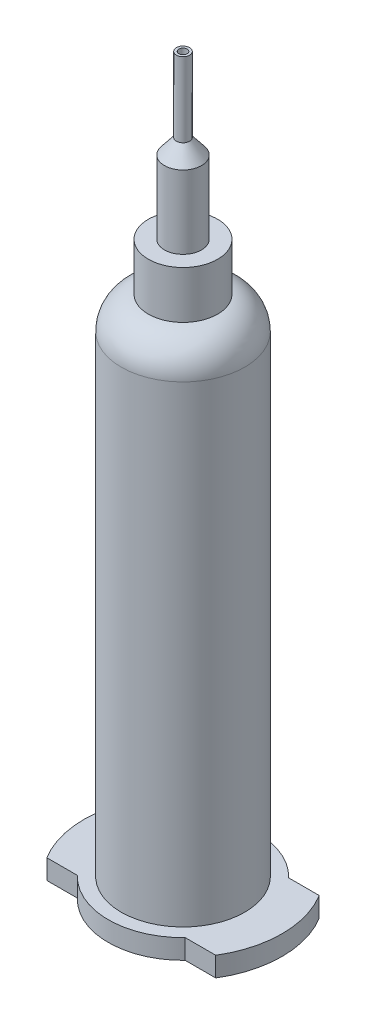
ISO-10303-21;
HEADER;
FILE_DESCRIPTION(('STEP AP214'),'2;1');
FILE_NAME('part.step','',(''),(''),'','','');
FILE_SCHEMA(('AUTOMOTIVE_DESIGN { 1 0 10303 214 1 1 1 1 }'));
ENDSEC;
DATA;
#1=APPLICATION_CONTEXT('core data for automotive mechanical design processes');
#2=APPLICATION_PROTOCOL_DEFINITION('international standard','automotive_design',2000,#1);
#3=PRODUCT_CONTEXT('',#1,'mechanical');
#4=PRODUCT('Part','Part','',(#3));
#5=PRODUCT_RELATED_PRODUCT_CATEGORY('part','',(#4));
#6=PRODUCT_DEFINITION_FORMATION('','',#4);
#7=PRODUCT_DEFINITION_CONTEXT('part definition',#1,'design');
#8=PRODUCT_DEFINITION('design','',#6,#7);
#9=PRODUCT_DEFINITION_SHAPE('','',#8);
#10=(LENGTH_UNIT() NAMED_UNIT(*) SI_UNIT(.MILLI.,.METRE.));
#11=(NAMED_UNIT(*) PLANE_ANGLE_UNIT() SI_UNIT($,.RADIAN.));
#12=(NAMED_UNIT(*) SI_UNIT($,.STERADIAN.) SOLID_ANGLE_UNIT());
#13=UNCERTAINTY_MEASURE_WITH_UNIT(LENGTH_MEASURE(1.E-05),#10,'distance_accuracy_value','');
#14=(GEOMETRIC_REPRESENTATION_CONTEXT(3) GLOBAL_UNCERTAINTY_ASSIGNED_CONTEXT((#13)) GLOBAL_UNIT_ASSIGNED_CONTEXT((#10,
#11,#12)) REPRESENTATION_CONTEXT('',''));
#15=CARTESIAN_POINT('',(0.,0.,0.));
#16=DIRECTION('',(0.,0.,1.));
#17=DIRECTION('',(1.,0.,0.));
#18=AXIS2_PLACEMENT_3D('',#15,#16,#17);
#19=CARTESIAN_POINT('',(0.,-14.38,0.));
#20=DIRECTION('',(0.,1.,0.));
#21=DIRECTION('',(0.,0.,1.));
#22=AXIS2_PLACEMENT_3D('',#19,#20,#21);
#23=CYLINDRICAL_SURFACE('',#22,7.925);
#24=CARTESIAN_POINT('',(0.,-14.38,0.));
#25=DIRECTION('',(0.,1.,0.));
#26=DIRECTION('',(0.,0.,1.));
#27=AXIS2_PLACEMENT_3D('',#24,#25,#26);
#28=CIRCLE('',#27,7.925);
#29=CARTESIAN_POINT('',(0.,-14.38,7.925));
#30=VERTEX_POINT('',#29);
#31=EDGE_CURVE('E11',#30,#30,#28,.T.);
#32=ORIENTED_EDGE('',*,*,#31,.T.);
#33=EDGE_LOOP('',(#32));
#34=FACE_BOUND('',#33,.T.);
#35=CARTESIAN_POINT('',(0.,16.62,0.));
#36=DIRECTION('',(0.,1.,0.));
#37=DIRECTION('',(0.,0.,1.));
#38=AXIS2_PLACEMENT_3D('',#35,#36,#37);
#39=CIRCLE('',#38,7.925);
#40=CARTESIAN_POINT('',(0.,16.62,7.925));
#41=VERTEX_POINT('',#40);
#42=EDGE_CURVE('E52',#41,#41,#39,.T.);
#43=ORIENTED_EDGE('',*,*,#42,.F.);
#44=EDGE_LOOP('',(#43));
#45=FACE_BOUND('',#44,.T.);
#46=ADVANCED_FACE('F49',(#34,#45),#23,.T.);
#47=CARTESIAN_POINT('',(0.,-14.38,0.));
#48=DIRECTION('',(0.,1.,0.));
#49=DIRECTION('',(0.,0.,1.));
#50=AXIS2_PLACEMENT_3D('',#47,#48,#49);
#51=PLANE('',#50);
#52=ORIENTED_EDGE('',*,*,#31,.F.);
#53=EDGE_LOOP('',(#52));
#54=FACE_BOUND('',#53,.T.);
#55=ADVANCED_FACE('F64',(#54),#51,.F.);
#56=CARTESIAN_POINT('',(0.,16.62,0.));
#57=DIRECTION('',(0.,1.,0.));
#58=DIRECTION('',(0.,0.,1.));
#59=AXIS2_PLACEMENT_3D('',#56,#57,#58);
#60=PLANE('',#59);
#61=ORIENTED_EDGE('',*,*,#42,.T.);
#62=EDGE_LOOP('',(#61));
#63=FACE_BOUND('',#62,.T.);
#64=ADVANCED_FACE('F61',(#63),#60,.T.);
#65=CLOSED_SHELL('',(#46,#55,#64));
#66=MANIFOLD_SOLID_BREP('B2',#65);
#67=CARTESIAN_POINT('',(0.,24.5223538498266,0.));
#68=DIRECTION('',(0.,1.,0.));
#69=DIRECTION('',(0.,0.,1.));
#70=AXIS2_PLACEMENT_3D('',#67,#68,#69);
#71=CYLINDRICAL_SURFACE('',#70,15.075);
#72=DIRECTION('',(0.,1.,0.));
#73=VECTOR('',#72,1.);
#74=CARTESIAN_POINT('',(-12.8545711713771,-84.0783145535444,-7.875));
#75=LINE('',#74,#73);
#76=CARTESIAN_POINT('',(-12.8545711713771,-57.38,-7.875));
#77=VERTEX_POINT('',#76);
#78=CARTESIAN_POINT('',(-12.8545711713771,-54.38,-7.875));
#79=VERTEX_POINT('',#78);
#80=EDGE_CURVE('E194',#77,#79,#75,.T.);
#81=ORIENTED_EDGE('',*,*,#80,.F.);
#82=CARTESIAN_POINT('',(0.,-57.38,0.));
#83=DIRECTION('',(0.,1.,0.));
#84=DIRECTION('',(0.,0.,1.));
#85=AXIS2_PLACEMENT_3D('',#82,#83,#84);
#86=CIRCLE('',#85,15.075);
#87=CARTESIAN_POINT('',(-12.8545711713771,-57.38,7.875));
#88=VERTEX_POINT('',#87);
#89=EDGE_CURVE('E182',#77,#88,#86,.T.);
#90=ORIENTED_EDGE('',*,*,#89,.T.);
#91=DIRECTION('',(0.,1.,0.));
#92=VECTOR('',#91,1.);
#93=CARTESIAN_POINT('',(-12.8545711713771,-84.0783145535444,7.875));
#94=LINE('',#93,#92);
#95=CARTESIAN_POINT('',(-12.8545711713771,-54.38,7.875));
#96=VERTEX_POINT('',#95);
#97=EDGE_CURVE('E200',#88,#96,#94,.T.);
#98=ORIENTED_EDGE('',*,*,#97,.T.);
#99=CARTESIAN_POINT('',(0.,-54.38,0.));
#100=DIRECTION('',(0.,1.,0.));
#101=DIRECTION('',(0.,0.,1.));
#102=AXIS2_PLACEMENT_3D('',#99,#100,#101);
#103=CIRCLE('',#102,15.075);
#104=EDGE_CURVE('E197',#79,#96,#103,.T.);
#105=ORIENTED_EDGE('',*,*,#104,.F.);
#106=EDGE_LOOP('',(#81,#90,#98,#105));
#107=FACE_BOUND('',#106,.T.);
#108=ADVANCED_FACE('F96',(#107),#71,.T.);
#109=CARTESIAN_POINT('',(0.,24.5223538498266,0.));
#110=DIRECTION('',(0.,1.,0.));
#111=DIRECTION('',(0.,0.,1.));
#112=AXIS2_PLACEMENT_3D('',#109,#110,#111);
#113=CYLINDRICAL_SURFACE('',#112,1.);
#114=CARTESIAN_POINT('',(0.,43.03,0.));
#115=DIRECTION('',(0.,1.,0.));
#116=DIRECTION('',(0.,0.,1.));
#117=AXIS2_PLACEMENT_3D('',#114,#115,#116);
#118=CIRCLE('',#117,1.);
#119=CARTESIAN_POINT('',(0.,43.03,1.));
#120=VERTEX_POINT('',#119);
#121=EDGE_CURVE('E225',#120,#120,#118,.T.);
#122=ORIENTED_EDGE('',*,*,#121,.T.);
#123=EDGE_LOOP('',(#122));
#124=FACE_BOUND('',#123,.T.);
#125=CARTESIAN_POINT('',(0.,54.38,0.));
#126=DIRECTION('',(0.,1.,0.));
#127=DIRECTION('',(0.,0.,1.));
#128=AXIS2_PLACEMENT_3D('',#125,#126,#127);
#129=CIRCLE('',#128,1.);
#130=CARTESIAN_POINT('',(0.,54.38,1.));
#131=VERTEX_POINT('',#130);
#132=EDGE_CURVE('E222',#131,#131,#129,.T.);
#133=ORIENTED_EDGE('',*,*,#132,.F.);
#134=EDGE_LOOP('',(#133));
#135=FACE_BOUND('',#134,.T.);
#136=ADVANCED_FACE('F285',(#124,#135),#113,.T.);
#137=CARTESIAN_POINT('',(0.,54.38,0.));
#138=DIRECTION('',(0.,1.,0.));
#139=DIRECTION('',(0.,0.,1.));
#140=AXIS2_PLACEMENT_3D('',#137,#138,#139);
#141=PLANE('',#140);
#142=CARTESIAN_POINT('',(0.,54.38,0.));
#143=DIRECTION('',(0.,1.,0.));
#144=DIRECTION('',(0.,0.,1.));
#145=AXIS2_PLACEMENT_3D('',#142,#143,#144);
#146=CIRCLE('',#145,0.627370955077484);
#147=CARTESIAN_POINT('',(0.,54.38,0.627370955077484));
#148=VERTEX_POINT('',#147);
#149=EDGE_CURVE('E356',#148,#148,#146,.T.);
#150=ORIENTED_EDGE('',*,*,#149,.F.);
#151=EDGE_LOOP('',(#150));
#152=FACE_BOUND('',#151,.T.);
#153=ORIENTED_EDGE('',*,*,#132,.T.);
#154=EDGE_LOOP('',(#153));
#155=FACE_BOUND('',#154,.T.);
#156=ADVANCED_FACE('F283',(#152,#155),#141,.T.);
#157=CARTESIAN_POINT('',(0.,43.03,0.));
#158=DIRECTION('',(0.,-1.,0.));
#159=DIRECTION('',(0.,0.,-1.));
#160=AXIS2_PLACEMENT_3D('',#157,#158,#159);
#161=CONICAL_SURFACE('',#160,1.,0.672874277724978);
#162=CARTESIAN_POINT('',(0.,40.74,0.));
#163=DIRECTION('',(0.,1.,0.));
#164=DIRECTION('',(0.,0.,1.));
#165=AXIS2_PLACEMENT_3D('',#162,#163,#164);
#166=CIRCLE('',#165,2.82499999999999);
#167=CARTESIAN_POINT('',(0.,40.74,2.82499999999999));
#168=VERTEX_POINT('',#167);
#169=EDGE_CURVE('E229',#168,#168,#166,.T.);
#170=ORIENTED_EDGE('',*,*,#169,.T.);
#171=EDGE_LOOP('',(#170));
#172=FACE_BOUND('',#171,.T.);
#173=ORIENTED_EDGE('',*,*,#121,.F.);
#174=EDGE_LOOP('',(#173));
#175=FACE_BOUND('',#174,.T.);
#176=ADVANCED_FACE('F277',(#172,#175),#161,.T.);
#177=CARTESIAN_POINT('',(0.,24.5223538498266,0.));
#178=DIRECTION('',(0.,1.,0.));
#179=DIRECTION('',(0.,0.,1.));
#180=AXIS2_PLACEMENT_3D('',#177,#178,#179);
#181=CYLINDRICAL_SURFACE('',#180,2.82499999999999);
#182=CARTESIAN_POINT('',(0.,29.62,0.));
#183=DIRECTION('',(0.,1.,0.));
#184=DIRECTION('',(0.,0.,1.));
#185=AXIS2_PLACEMENT_3D('',#182,#183,#184);
#186=CIRCLE('',#185,2.82499999999999);
#187=CARTESIAN_POINT('',(0.,29.62,2.82499999999999));
#188=VERTEX_POINT('',#187);
#189=EDGE_CURVE('E232',#188,#188,#186,.T.);
#190=ORIENTED_EDGE('',*,*,#189,.T.);
#191=EDGE_LOOP('',(#190));
#192=FACE_BOUND('',#191,.T.);
#193=ORIENTED_EDGE('',*,*,#169,.F.);
#194=EDGE_LOOP('',(#193));
#195=FACE_BOUND('',#194,.T.);
#196=ADVANCED_FACE('F271',(#192,#195),#181,.T.);
#197=CARTESIAN_POINT('',(0.,29.62,0.));
#198=DIRECTION('',(0.,1.,0.));
#199=DIRECTION('',(0.,0.,1.));
#200=AXIS2_PLACEMENT_3D('',#197,#198,#199);
#201=PLANE('',#200);
#202=CARTESIAN_POINT('',(0.,29.62,0.));
#203=DIRECTION('',(0.,1.,0.));
#204=DIRECTION('',(0.,0.,1.));
#205=AXIS2_PLACEMENT_3D('',#202,#203,#204);
#206=CIRCLE('',#205,5.27500000000001);
#207=CARTESIAN_POINT('',(0.,29.62,5.27500000000001));
#208=VERTEX_POINT('',#207);
#209=EDGE_CURVE('E235',#208,#208,#206,.T.);
#210=ORIENTED_EDGE('',*,*,#209,.T.);
#211=EDGE_LOOP('',(#210));
#212=FACE_BOUND('',#211,.T.);
#213=ORIENTED_EDGE('',*,*,#189,.F.);
#214=EDGE_LOOP('',(#213));
#215=FACE_BOUND('',#214,.T.);
#216=ADVANCED_FACE('F265',(#212,#215),#201,.T.);
#217=CARTESIAN_POINT('',(0.,24.5223538498266,0.));
#218=DIRECTION('',(0.,1.,0.));
#219=DIRECTION('',(0.,0.,1.));
#220=AXIS2_PLACEMENT_3D('',#217,#218,#219);
#221=CYLINDRICAL_SURFACE('',#220,5.27500000000001);
#222=CARTESIAN_POINT('',(0.,22.38,0.));
#223=DIRECTION('',(0.,1.,0.));
#224=DIRECTION('',(0.,0.,1.));
#225=AXIS2_PLACEMENT_3D('',#222,#223,#224);
#226=CIRCLE('',#225,5.27500000000001);
#227=CARTESIAN_POINT('',(0.,22.38,5.27500000000001));
#228=VERTEX_POINT('',#227);
#229=EDGE_CURVE('E238',#228,#228,#226,.T.);
#230=ORIENTED_EDGE('',*,*,#229,.T.);
#231=EDGE_LOOP('',(#230));
#232=FACE_BOUND('',#231,.T.);
#233=ORIENTED_EDGE('',*,*,#209,.F.);
#234=EDGE_LOOP('',(#233));
#235=FACE_BOUND('',#234,.T.);
#236=ADVANCED_FACE('F262',(#232,#235),#221,.T.);
#237=CARTESIAN_POINT('',(0.,24.5223538498266,0.));
#238=DIRECTION('',(0.,1.,0.));
#239=DIRECTION('',(0.,0.,1.));
#240=AXIS2_PLACEMENT_3D('',#237,#238,#239);
#241=CYLINDRICAL_SURFACE('',#240,9.4);
#242=CARTESIAN_POINT('',(0.,17.4571578331212,0.));
#243=DIRECTION('',(0.,1.,0.));
#244=DIRECTION('',(0.,0.,1.));
#245=AXIS2_PLACEMENT_3D('',#242,#243,#244);
#246=CIRCLE('',#245,9.4);
#247=CARTESIAN_POINT('',(0.,17.4571578331212,9.4));
#248=VERTEX_POINT('',#247);
#249=EDGE_CURVE('E104',#248,#248,#246,.F.);
#250=ORIENTED_EDGE('',*,*,#249,.T.);
#251=EDGE_LOOP('',(#250));
#252=FACE_BOUND('',#251,.T.);
#253=CARTESIAN_POINT('',(0.,-54.38,0.));
#254=DIRECTION('',(0.,1.,0.));
#255=DIRECTION('',(0.,0.,1.));
#256=AXIS2_PLACEMENT_3D('',#253,#254,#255);
#257=CIRCLE('',#256,9.4);
#258=CARTESIAN_POINT('',(0.,-54.38,9.4));
#259=VERTEX_POINT('',#258);
#260=EDGE_CURVE('E241',#259,#259,#257,.T.);
#261=ORIENTED_EDGE('',*,*,#260,.T.);
#262=EDGE_LOOP('',(#261));
#263=FACE_BOUND('',#262,.T.);
#264=ADVANCED_FACE('F251',(#252,#263),#241,.T.);
#265=CARTESIAN_POINT('',(15.075,-57.38,0.));
#266=DIRECTION('',(0.,-1.,0.));
#267=DIRECTION('',(0.,0.,-1.));
#268=AXIS2_PLACEMENT_3D('',#265,#266,#267);
#269=PLANE('',#268);
#270=CARTESIAN_POINT('',(0.,-57.38,0.));
#271=DIRECTION('',(0.,-1.,0.));
#272=DIRECTION('',(0.,0.,-1.));
#273=AXIS2_PLACEMENT_3D('',#270,#271,#272);
#274=CIRCLE('',#273,7.925);
#275=CARTESIAN_POINT('',(0.,-57.38,-7.925));
#276=VERTEX_POINT('',#275);
#277=EDGE_CURVE('E353',#276,#276,#274,.T.);
#278=ORIENTED_EDGE('',*,*,#277,.F.);
#279=EDGE_LOOP('',(#278));
#280=FACE_BOUND('',#279,.T.);
#281=DIRECTION('',(1.,0.,0.));
#282=VECTOR('',#281,1.);
#283=CARTESIAN_POINT('',(-12.8545711713771,-57.38,-7.875));
#284=LINE('',#283,#282);
#285=CARTESIAN_POINT('',(-8.208227579691,-57.38,-7.875));
#286=VERTEX_POINT('',#285);
#287=EDGE_CURVE('E173',#77,#286,#284,.T.);
#288=ORIENTED_EDGE('',*,*,#287,.T.);
#289=CARTESIAN_POINT('',(0.,-57.38,0.));
#290=DIRECTION('',(0.,-1.,0.));
#291=DIRECTION('',(0.,0.,-1.));
#292=AXIS2_PLACEMENT_3D('',#289,#290,#291);
#293=CIRCLE('',#292,11.375);
#294=CARTESIAN_POINT('',(8.208227579691,-57.38,-7.875));
#295=VERTEX_POINT('',#294);
#296=EDGE_CURVE('E161',#286,#295,#293,.T.);
#297=ORIENTED_EDGE('',*,*,#296,.T.);
#298=DIRECTION('',(1.,0.,0.));
#299=VECTOR('',#298,1.);
#300=CARTESIAN_POINT('',(8.208227579691,-57.38,-7.875));
#301=LINE('',#300,#299);
#302=CARTESIAN_POINT('',(12.8545711713771,-57.38,-7.875));
#303=VERTEX_POINT('',#302);
#304=EDGE_CURVE('E189',#295,#303,#301,.T.);
#305=ORIENTED_EDGE('',*,*,#304,.T.);
#306=CARTESIAN_POINT('',(12.8545711713771,-57.38,7.875));
#307=VERTEX_POINT('',#306);
#308=EDGE_CURVE('E226',#307,#303,#86,.T.);
#309=ORIENTED_EDGE('',*,*,#308,.F.);
#310=DIRECTION('',(-1.,0.,0.));
#311=VECTOR('',#310,1.);
#312=CARTESIAN_POINT('',(8.208227579691,-57.38,7.875));
#313=LINE('',#312,#311);
#314=CARTESIAN_POINT('',(8.208227579691,-57.38,7.875));
#315=VERTEX_POINT('',#314);
#316=EDGE_CURVE('E204',#307,#315,#313,.T.);
#317=ORIENTED_EDGE('',*,*,#316,.T.);
#318=CARTESIAN_POINT('',(0.,-57.38,0.));
#319=DIRECTION('',(0.,-1.,0.));
#320=DIRECTION('',(0.,0.,-1.));
#321=AXIS2_PLACEMENT_3D('',#318,#319,#320);
#322=CIRCLE('',#321,11.375);
#323=CARTESIAN_POINT('',(-8.208227579691,-57.38,7.875));
#324=VERTEX_POINT('',#323);
#325=EDGE_CURVE('E205',#315,#324,#322,.T.);
#326=ORIENTED_EDGE('',*,*,#325,.T.);
#327=DIRECTION('',(-1.,0.,0.));
#328=VECTOR('',#327,1.);
#329=CARTESIAN_POINT('',(-12.8545711713771,-57.38,7.875));
#330=LINE('',#329,#328);
#331=EDGE_CURVE('E208',#324,#88,#330,.T.);
#332=ORIENTED_EDGE('',*,*,#331,.T.);
#333=ORIENTED_EDGE('',*,*,#89,.F.);
#334=EDGE_LOOP('',(#288,#297,#305,#309,#317,#326,#332,#333));
#335=FACE_BOUND('',#334,.T.);
#336=ADVANCED_FACE('F179',(#280,#335),#269,.T.);
#337=DIRECTION('',(0.,1.,0.));
#338=VECTOR('',#337,1.);
#339=CARTESIAN_POINT('',(12.8545711713771,-84.0783145535444,-7.875));
#340=LINE('',#339,#338);
#341=CARTESIAN_POINT('',(12.8545711713771,-54.38,-7.875));
#342=VERTEX_POINT('',#341);
#343=EDGE_CURVE('E190',#303,#342,#340,.T.);
#344=ORIENTED_EDGE('',*,*,#343,.T.);
#345=CARTESIAN_POINT('',(12.8545711713771,-54.38,7.875));
#346=VERTEX_POINT('',#345);
#347=EDGE_CURVE('E244',#346,#342,#103,.T.);
#348=ORIENTED_EDGE('',*,*,#347,.F.);
#349=DIRECTION('',(0.,1.,0.));
#350=VECTOR('',#349,1.);
#351=CARTESIAN_POINT('',(12.8545711713771,-84.0783145535444,7.875));
#352=LINE('',#351,#350);
#353=EDGE_CURVE('E198',#307,#346,#352,.T.);
#354=ORIENTED_EDGE('',*,*,#353,.F.);
#355=ORIENTED_EDGE('',*,*,#308,.T.);
#356=EDGE_LOOP('',(#344,#348,#354,#355));
#357=FACE_BOUND('',#356,.T.);
#358=ADVANCED_FACE('F259',(#357),#71,.T.);
#359=CARTESIAN_POINT('',(9.4,-54.38,0.));
#360=DIRECTION('',(0.,1.,0.));
#361=DIRECTION('',(0.,0.,1.));
#362=AXIS2_PLACEMENT_3D('',#359,#360,#361);
#363=PLANE('',#362);
#364=DIRECTION('',(1.,0.,0.));
#365=VECTOR('',#364,1.);
#366=CARTESIAN_POINT('',(-12.8545711713771,-54.38,-7.875));
#367=LINE('',#366,#365);
#368=CARTESIAN_POINT('',(-8.208227579691,-54.38,-7.875));
#369=VERTEX_POINT('',#368);
#370=EDGE_CURVE('E176',#79,#369,#367,.T.);
#371=ORIENTED_EDGE('',*,*,#370,.F.);
#372=ORIENTED_EDGE('',*,*,#104,.T.);
#373=DIRECTION('',(-1.,0.,0.));
#374=VECTOR('',#373,1.);
#375=CARTESIAN_POINT('',(-12.8545711713771,-54.38,7.875));
#376=LINE('',#375,#374);
#377=CARTESIAN_POINT('',(-8.208227579691,-54.38,7.875));
#378=VERTEX_POINT('',#377);
#379=EDGE_CURVE('E216',#378,#96,#376,.T.);
#380=ORIENTED_EDGE('',*,*,#379,.F.);
#381=CARTESIAN_POINT('',(0.,-54.38,0.));
#382=DIRECTION('',(0.,-1.,0.));
#383=DIRECTION('',(0.,0.,1.));
#384=AXIS2_PLACEMENT_3D('',#381,#382,#383);
#385=CIRCLE('',#384,11.375);
#386=CARTESIAN_POINT('',(8.208227579691,-54.38,7.875));
#387=VERTEX_POINT('',#386);
#388=EDGE_CURVE('E119',#387,#378,#385,.T.);
#389=ORIENTED_EDGE('',*,*,#388,.F.);
#390=DIRECTION('',(-1.,0.,0.));
#391=VECTOR('',#390,1.);
#392=CARTESIAN_POINT('',(8.208227579691,-54.38,7.875));
#393=LINE('',#392,#391);
#394=EDGE_CURVE('E217',#346,#387,#393,.T.);
#395=ORIENTED_EDGE('',*,*,#394,.F.);
#396=ORIENTED_EDGE('',*,*,#347,.T.);
#397=DIRECTION('',(1.,0.,0.));
#398=VECTOR('',#397,1.);
#399=CARTESIAN_POINT('',(8.208227579691,-54.38,-7.875));
#400=LINE('',#399,#398);
#401=CARTESIAN_POINT('',(8.208227579691,-54.38,-7.875));
#402=VERTEX_POINT('',#401);
#403=EDGE_CURVE('E183',#402,#342,#400,.T.);
#404=ORIENTED_EDGE('',*,*,#403,.F.);
#405=CARTESIAN_POINT('',(0.,-54.38,0.));
#406=DIRECTION('',(0.,-1.,0.));
#407=DIRECTION('',(0.,0.,-1.));
#408=AXIS2_PLACEMENT_3D('',#405,#406,#407);
#409=CIRCLE('',#408,11.375);
#410=EDGE_CURVE('E111',#369,#402,#409,.T.);
#411=ORIENTED_EDGE('',*,*,#410,.F.);
#412=EDGE_LOOP('',(#371,#372,#380,#389,#395,#396,#404,#411));
#413=FACE_BOUND('',#412,.T.);
#414=ORIENTED_EDGE('',*,*,#260,.F.);
#415=EDGE_LOOP('',(#414));
#416=FACE_BOUND('',#415,.T.);
#417=ADVANCED_FACE('F258',(#413,#416),#363,.T.);
#418=CARTESIAN_POINT('',(0.,17.4571578331212,0.));
#419=DIRECTION('',(0.,1.,0.));
#420=DIRECTION('',(0.,0.,1.));
#421=AXIS2_PLACEMENT_3D('',#418,#419,#420);
#422=DEGENERATE_TOROIDAL_SURFACE('',#421,4.4,5.,.T.);
#423=ORIENTED_EDGE('',*,*,#249,.F.);
#424=EDGE_LOOP('',(#423));
#425=FACE_BOUND('',#424,.T.);
#426=ORIENTED_EDGE('',*,*,#229,.F.);
#427=EDGE_LOOP('',(#426));
#428=FACE_BOUND('',#427,.T.);
#429=ADVANCED_FACE('F254',(#425,#428),#422,.T.);
#430=CARTESIAN_POINT('',(8.208227579691,-84.0783145535444,7.875));
#431=DIRECTION('',(0.,0.,-1.));
#432=DIRECTION('',(-1.,0.,0.));
#433=AXIS2_PLACEMENT_3D('',#430,#431,#432);
#434=PLANE('',#433);
#435=ORIENTED_EDGE('',*,*,#353,.T.);
#436=ORIENTED_EDGE('',*,*,#394,.T.);
#437=DIRECTION('',(0.,1.,0.));
#438=VECTOR('',#437,1.);
#439=CARTESIAN_POINT('',(8.208227579691,-84.0783145535444,7.875));
#440=LINE('',#439,#438);
#441=EDGE_CURVE('E202',#315,#387,#440,.T.);
#442=ORIENTED_EDGE('',*,*,#441,.F.);
#443=ORIENTED_EDGE('',*,*,#316,.F.);
#444=EDGE_LOOP('',(#435,#436,#442,#443));
#445=FACE_BOUND('',#444,.T.);
#446=ADVANCED_FACE('F257',(#445),#434,.F.);
#447=CARTESIAN_POINT('',(0.,-84.0783145535444,0.));
#448=DIRECTION('',(0.,1.,0.));
#449=DIRECTION('',(0.,0.,1.));
#450=AXIS2_PLACEMENT_3D('',#447,#448,#449);
#451=CYLINDRICAL_SURFACE('',#450,11.375);
#452=ORIENTED_EDGE('',*,*,#441,.T.);
#453=ORIENTED_EDGE('',*,*,#388,.T.);
#454=DIRECTION('',(0.,1.,0.));
#455=VECTOR('',#454,1.);
#456=CARTESIAN_POINT('',(-8.208227579691,-84.0783145535444,7.875));
#457=LINE('',#456,#455);
#458=EDGE_CURVE('E206',#324,#378,#457,.T.);
#459=ORIENTED_EDGE('',*,*,#458,.F.);
#460=ORIENTED_EDGE('',*,*,#325,.F.);
#461=EDGE_LOOP('',(#452,#453,#459,#460));
#462=FACE_BOUND('',#461,.T.);
#463=ADVANCED_FACE('F344',(#462),#451,.T.);
#464=CARTESIAN_POINT('',(-12.8545711713771,-84.0783145535444,7.875));
#465=DIRECTION('',(0.,0.,-1.));
#466=DIRECTION('',(-1.,0.,0.));
#467=AXIS2_PLACEMENT_3D('',#464,#465,#466);
#468=PLANE('',#467);
#469=ORIENTED_EDGE('',*,*,#458,.T.);
#470=ORIENTED_EDGE('',*,*,#379,.T.);
#471=ORIENTED_EDGE('',*,*,#97,.F.);
#472=ORIENTED_EDGE('',*,*,#331,.F.);
#473=EDGE_LOOP('',(#469,#470,#471,#472));
#474=FACE_BOUND('',#473,.T.);
#475=ADVANCED_FACE('F341',(#474),#468,.F.);
#476=CARTESIAN_POINT('',(-12.8545711713771,-84.0783145535444,-7.875));
#477=DIRECTION('',(0.,0.,1.));
#478=DIRECTION('',(1.,0.,0.));
#479=AXIS2_PLACEMENT_3D('',#476,#477,#478);
#480=PLANE('',#479);
#481=ORIENTED_EDGE('',*,*,#80,.T.);
#482=ORIENTED_EDGE('',*,*,#370,.T.);
#483=DIRECTION('',(0.,1.,0.));
#484=VECTOR('',#483,1.);
#485=CARTESIAN_POINT('',(-8.208227579691,-84.0783145535444,-7.875));
#486=LINE('',#485,#484);
#487=EDGE_CURVE('E164',#286,#369,#486,.T.);
#488=ORIENTED_EDGE('',*,*,#487,.F.);
#489=ORIENTED_EDGE('',*,*,#287,.F.);
#490=EDGE_LOOP('',(#481,#482,#488,#489));
#491=FACE_BOUND('',#490,.T.);
#492=ADVANCED_FACE('F172',(#491),#480,.F.);
#493=CARTESIAN_POINT('',(0.,-84.0783145535444,0.));
#494=DIRECTION('',(0.,1.,0.));
#495=DIRECTION('',(0.,0.,1.));
#496=AXIS2_PLACEMENT_3D('',#493,#494,#495);
#497=CYLINDRICAL_SURFACE('',#496,11.375);
#498=ORIENTED_EDGE('',*,*,#487,.T.);
#499=ORIENTED_EDGE('',*,*,#410,.T.);
#500=DIRECTION('',(0.,1.,0.));
#501=VECTOR('',#500,1.);
#502=CARTESIAN_POINT('',(8.208227579691,-84.0783145535444,-7.875));
#503=LINE('',#502,#501);
#504=EDGE_CURVE('E166',#295,#402,#503,.T.);
#505=ORIENTED_EDGE('',*,*,#504,.F.);
#506=ORIENTED_EDGE('',*,*,#296,.F.);
#507=EDGE_LOOP('',(#498,#499,#505,#506));
#508=FACE_BOUND('',#507,.T.);
#509=ADVANCED_FACE('F163',(#508),#497,.T.);
#510=CARTESIAN_POINT('',(8.208227579691,-84.0783145535444,-7.875));
#511=DIRECTION('',(0.,0.,1.));
#512=DIRECTION('',(1.,0.,0.));
#513=AXIS2_PLACEMENT_3D('',#510,#511,#512);
#514=PLANE('',#513);
#515=ORIENTED_EDGE('',*,*,#504,.T.);
#516=ORIENTED_EDGE('',*,*,#403,.T.);
#517=ORIENTED_EDGE('',*,*,#343,.F.);
#518=ORIENTED_EDGE('',*,*,#304,.F.);
#519=EDGE_LOOP('',(#515,#516,#517,#518));
#520=FACE_BOUND('',#519,.T.);
#521=ADVANCED_FACE('F325',(#520),#514,.F.);
#522=CARTESIAN_POINT('',(0.,16.62,0.));
#523=DIRECTION('',(0.,-1.,0.));
#524=DIRECTION('',(0.,0.,-1.));
#525=AXIS2_PLACEMENT_3D('',#522,#523,#524);
#526=CYLINDRICAL_SURFACE('',#525,7.925);
#527=CARTESIAN_POINT('',(0.,16.62,0.));
#528=DIRECTION('',(0.,-1.,0.));
#529=DIRECTION('',(0.,0.,-1.));
#530=AXIS2_PLACEMENT_3D('',#527,#528,#529);
#531=CIRCLE('',#530,7.925);
#532=CARTESIAN_POINT('',(0.,16.62,-7.925));
#533=VERTEX_POINT('',#532);
#534=EDGE_CURVE('E201',#533,#533,#531,.T.);
#535=ORIENTED_EDGE('',*,*,#534,.F.);
#536=EDGE_LOOP('',(#535));
#537=FACE_BOUND('',#536,.T.);
#538=ORIENTED_EDGE('',*,*,#277,.T.);
#539=EDGE_LOOP('',(#538));
#540=FACE_BOUND('',#539,.T.);
#541=ADVANCED_FACE('F327',(#537,#540),#526,.F.);
#542=CARTESIAN_POINT('',(0.,13.38,0.));
#543=DIRECTION('',(0.,1.,0.));
#544=DIRECTION('',(0.,0.,1.));
#545=AXIS2_PLACEMENT_3D('',#542,#543,#544);
#546=CYLINDRICAL_SURFACE('',#545,0.627370955077484);
#547=CARTESIAN_POINT('',(0.,26.2479380565703,0.));
#548=DIRECTION('',(0.,-1.,0.));
#549=DIRECTION('',(0.,0.,-1.));
#550=AXIS2_PLACEMENT_3D('',#547,#548,#549);
#551=CIRCLE('',#550,0.627370955077484);
#552=CARTESIAN_POINT('',(0.,26.2479380565703,-0.627370955077484));
#553=VERTEX_POINT('',#552);
#554=EDGE_CURVE('E47',#553,#553,#551,.T.);
#555=ORIENTED_EDGE('',*,*,#554,.T.);
#556=EDGE_LOOP('',(#555));
#557=FACE_BOUND('',#556,.T.);
#558=ORIENTED_EDGE('',*,*,#149,.T.);
#559=EDGE_LOOP('',(#558));
#560=FACE_BOUND('',#559,.T.);
#561=ADVANCED_FACE('F333',(#557,#560),#546,.F.);
#562=CARTESIAN_POINT('',(0.,26.2479380565703,0.));
#563=DIRECTION('',(0.,-1.,0.));
#564=DIRECTION('',(0.,0.,-1.));
#565=AXIS2_PLACEMENT_3D('',#562,#563,#564);
#566=TOROIDAL_SURFACE('',#565,10.6273709550775,10.);
#567=ORIENTED_EDGE('',*,*,#534,.T.);
#568=EDGE_LOOP('',(#567));
#569=FACE_BOUND('',#568,.T.);
#570=ORIENTED_EDGE('',*,*,#554,.F.);
#571=EDGE_LOOP('',(#570));
#572=FACE_BOUND('',#571,.T.);
#573=ADVANCED_FACE('F98',(#569,#572),#566,.T.);
#574=CLOSED_SHELL('',(#108,#136,#156,#176,#196,#216,#236,#264,#336,#358,#417,#429,#446,#463,
#475,#492,#509,#521,#541,#561,#573));
#575=MANIFOLD_SOLID_BREP('B6',#574);
#576=ADVANCED_BREP_SHAPE_REPRESENTATION('',(#18,#66,#575),#14);
#577=SHAPE_DEFINITION_REPRESENTATION(#9,#576);
ENDSEC;
END-ISO-10303-21;
